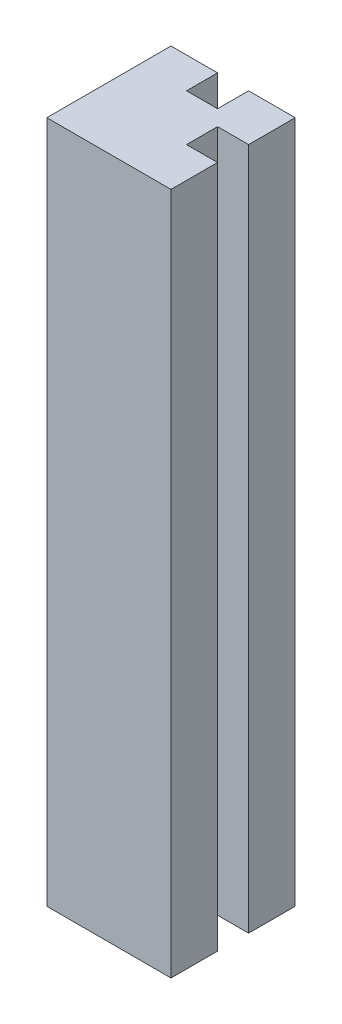
ISO-10303-21;
HEADER;
FILE_DESCRIPTION(('STEP AP214'),'2;1');
FILE_NAME('part.step','',(''),(''),'','','');
FILE_SCHEMA(('AUTOMOTIVE_DESIGN { 1 0 10303 214 1 1 1 1 }'));
ENDSEC;
DATA;
#1=APPLICATION_CONTEXT('core data for automotive mechanical design processes');
#2=APPLICATION_PROTOCOL_DEFINITION('international standard','automotive_design',2000,#1);
#3=PRODUCT_CONTEXT('',#1,'mechanical');
#4=PRODUCT('Part','Part','',(#3));
#5=PRODUCT_RELATED_PRODUCT_CATEGORY('part','',(#4));
#6=PRODUCT_DEFINITION_FORMATION('','',#4);
#7=PRODUCT_DEFINITION_CONTEXT('part definition',#1,'design');
#8=PRODUCT_DEFINITION('design','',#6,#7);
#9=PRODUCT_DEFINITION_SHAPE('','',#8);
#10=(LENGTH_UNIT() NAMED_UNIT(*) SI_UNIT(.MILLI.,.METRE.));
#11=(NAMED_UNIT(*) PLANE_ANGLE_UNIT() SI_UNIT($,.RADIAN.));
#12=(NAMED_UNIT(*) SI_UNIT($,.STERADIAN.) SOLID_ANGLE_UNIT());
#13=UNCERTAINTY_MEASURE_WITH_UNIT(LENGTH_MEASURE(1.E-05),#10,'distance_accuracy_value','');
#14=(GEOMETRIC_REPRESENTATION_CONTEXT(3) GLOBAL_UNCERTAINTY_ASSIGNED_CONTEXT((#13)) GLOBAL_UNIT_ASSIGNED_CONTEXT((#10,
#11,#12)) REPRESENTATION_CONTEXT('',''));
#15=CARTESIAN_POINT('',(0.,0.,0.));
#16=DIRECTION('',(0.,0.,1.));
#17=DIRECTION('',(1.,0.,0.));
#18=AXIS2_PLACEMENT_3D('',#15,#16,#17);
#19=CARTESIAN_POINT('',(10.,110.,-10.));
#20=DIRECTION('',(-1.,0.,0.));
#21=DIRECTION('',(0.,0.,1.));
#22=AXIS2_PLACEMENT_3D('',#19,#20,#21);
#23=PLANE('',#22);
#24=DIRECTION('',(0.,0.,-1.));
#25=VECTOR('',#24,1.);
#26=CARTESIAN_POINT('',(10.,0.,-10.));
#27=LINE('',#26,#25);
#28=CARTESIAN_POINT('',(10.,0.,10.));
#29=VERTEX_POINT('',#28);
#30=CARTESIAN_POINT('',(10.,0.,2.5));
#31=VERTEX_POINT('',#30);
#32=EDGE_CURVE('E189',#29,#31,#27,.T.);
#33=ORIENTED_EDGE('',*,*,#32,.T.);
#34=DIRECTION('',(0.,1.,0.));
#35=VECTOR('',#34,1.);
#36=CARTESIAN_POINT('',(10.,110.,2.5));
#37=LINE('',#36,#35);
#38=CARTESIAN_POINT('',(10.,110.,2.5));
#39=VERTEX_POINT('',#38);
#40=EDGE_CURVE('E136',#31,#39,#37,.T.);
#41=ORIENTED_EDGE('',*,*,#40,.T.);
#42=DIRECTION('',(0.,0.,-1.));
#43=VECTOR('',#42,1.);
#44=CARTESIAN_POINT('',(10.,110.,-10.));
#45=LINE('',#44,#43);
#46=CARTESIAN_POINT('',(10.,110.,10.));
#47=VERTEX_POINT('',#46);
#48=EDGE_CURVE('E176',#47,#39,#45,.T.);
#49=ORIENTED_EDGE('',*,*,#48,.F.);
#50=DIRECTION('',(0.,-1.,0.));
#51=VECTOR('',#50,1.);
#52=CARTESIAN_POINT('',(10.,110.,10.));
#53=LINE('',#52,#51);
#54=EDGE_CURVE('E188',#47,#29,#53,.T.);
#55=ORIENTED_EDGE('',*,*,#54,.T.);
#56=EDGE_LOOP('',(#33,#41,#49,#55));
#57=FACE_BOUND('',#56,.T.);
#58=ADVANCED_FACE('F33',(#57),#23,.F.);
#59=CARTESIAN_POINT('',(-10.,110.,-10.));
#60=DIRECTION('',(0.,0.,1.));
#61=DIRECTION('',(1.,0.,0.));
#62=AXIS2_PLACEMENT_3D('',#59,#60,#61);
#63=PLANE('',#62);
#64=DIRECTION('',(-1.,0.,0.));
#65=VECTOR('',#64,1.);
#66=CARTESIAN_POINT('',(-10.,0.,-10.));
#67=LINE('',#66,#65);
#68=CARTESIAN_POINT('',(10.,0.,-10.));
#69=VERTEX_POINT('',#68);
#70=CARTESIAN_POINT('',(2.5,0.,-10.));
#71=VERTEX_POINT('',#70);
#72=EDGE_CURVE('E192',#69,#71,#67,.T.);
#73=ORIENTED_EDGE('',*,*,#72,.T.);
#74=DIRECTION('',(0.,1.,0.));
#75=VECTOR('',#74,1.);
#76=CARTESIAN_POINT('',(2.5,110.,-10.));
#77=LINE('',#76,#75);
#78=CARTESIAN_POINT('',(2.5,110.,-10.));
#79=VERTEX_POINT('',#78);
#80=EDGE_CURVE('E172',#71,#79,#77,.T.);
#81=ORIENTED_EDGE('',*,*,#80,.T.);
#82=DIRECTION('',(-1.,0.,0.));
#83=VECTOR('',#82,1.);
#84=CARTESIAN_POINT('',(-10.,110.,-10.));
#85=LINE('',#84,#83);
#86=CARTESIAN_POINT('',(10.,110.,-10.));
#87=VERTEX_POINT('',#86);
#88=EDGE_CURVE('E181',#87,#79,#85,.T.);
#89=ORIENTED_EDGE('',*,*,#88,.F.);
#90=DIRECTION('',(0.,-1.,0.));
#91=VECTOR('',#90,1.);
#92=CARTESIAN_POINT('',(10.,110.,-10.));
#93=LINE('',#92,#91);
#94=EDGE_CURVE('E207',#87,#69,#93,.T.);
#95=ORIENTED_EDGE('',*,*,#94,.T.);
#96=EDGE_LOOP('',(#73,#81,#89,#95));
#97=FACE_BOUND('',#96,.T.);
#98=ADVANCED_FACE('F231',(#97),#63,.F.);
#99=CARTESIAN_POINT('',(10.,110.,-2.5));
#100=VERTEX_POINT('',#99);
#101=EDGE_CURVE('E180',#100,#87,#45,.T.);
#102=ORIENTED_EDGE('',*,*,#101,.F.);
#103=DIRECTION('',(0.,-1.,0.));
#104=VECTOR('',#103,1.);
#105=CARTESIAN_POINT('',(10.,110.,-2.5));
#106=LINE('',#105,#104);
#107=CARTESIAN_POINT('',(10.,0.,-2.5));
#108=VERTEX_POINT('',#107);
#109=EDGE_CURVE('E129',#100,#108,#106,.T.);
#110=ORIENTED_EDGE('',*,*,#109,.T.);
#111=EDGE_CURVE('E175',#108,#69,#27,.T.);
#112=ORIENTED_EDGE('',*,*,#111,.T.);
#113=ORIENTED_EDGE('',*,*,#94,.F.);
#114=EDGE_LOOP('',(#102,#110,#112,#113));
#115=FACE_BOUND('',#114,.T.);
#116=ADVANCED_FACE('F35',(#115),#23,.F.);
#117=CARTESIAN_POINT('',(-2.5,110.,-10.));
#118=VERTEX_POINT('',#117);
#119=CARTESIAN_POINT('',(-10.,110.,-10.));
#120=VERTEX_POINT('',#119);
#121=EDGE_CURVE('E179',#118,#120,#85,.T.);
#122=ORIENTED_EDGE('',*,*,#121,.F.);
#123=DIRECTION('',(0.,-1.,0.));
#124=VECTOR('',#123,1.);
#125=CARTESIAN_POINT('',(-2.5,110.,-10.));
#126=LINE('',#125,#124);
#127=CARTESIAN_POINT('',(-2.5,0.,-10.));
#128=VERTEX_POINT('',#127);
#129=EDGE_CURVE('E168',#118,#128,#126,.T.);
#130=ORIENTED_EDGE('',*,*,#129,.T.);
#131=CARTESIAN_POINT('',(-10.,0.,-10.));
#132=VERTEX_POINT('',#131);
#133=EDGE_CURVE('E191',#128,#132,#67,.T.);
#134=ORIENTED_EDGE('',*,*,#133,.T.);
#135=DIRECTION('',(0.,-1.,0.));
#136=VECTOR('',#135,1.);
#137=CARTESIAN_POINT('',(-10.,110.,-10.));
#138=LINE('',#137,#136);
#139=EDGE_CURVE('E204',#120,#132,#138,.T.);
#140=ORIENTED_EDGE('',*,*,#139,.F.);
#141=EDGE_LOOP('',(#122,#130,#134,#140));
#142=FACE_BOUND('',#141,.T.);
#143=ADVANCED_FACE('F217',(#142),#63,.F.);
#144=CARTESIAN_POINT('',(-10.,110.,-10.));
#145=DIRECTION('',(1.,0.,0.));
#146=DIRECTION('',(0.,0.,-1.));
#147=AXIS2_PLACEMENT_3D('',#144,#145,#146);
#148=PLANE('',#147);
#149=DIRECTION('',(0.,0.,1.));
#150=VECTOR('',#149,1.);
#151=CARTESIAN_POINT('',(-10.,0.,-10.));
#152=LINE('',#151,#150);
#153=CARTESIAN_POINT('',(-10.,0.,10.));
#154=VERTEX_POINT('',#153);
#155=EDGE_CURVE('E195',#132,#154,#152,.T.);
#156=ORIENTED_EDGE('',*,*,#155,.T.);
#157=DIRECTION('',(0.,-1.,0.));
#158=VECTOR('',#157,1.);
#159=CARTESIAN_POINT('',(-10.,110.,10.));
#160=LINE('',#159,#158);
#161=CARTESIAN_POINT('',(-10.,110.,10.));
#162=VERTEX_POINT('',#161);
#163=EDGE_CURVE('E201',#162,#154,#160,.T.);
#164=ORIENTED_EDGE('',*,*,#163,.F.);
#165=DIRECTION('',(0.,0.,1.));
#166=VECTOR('',#165,1.);
#167=CARTESIAN_POINT('',(-10.,110.,-10.));
#168=LINE('',#167,#166);
#169=EDGE_CURVE('E184',#120,#162,#168,.T.);
#170=ORIENTED_EDGE('',*,*,#169,.F.);
#171=ORIENTED_EDGE('',*,*,#139,.T.);
#172=EDGE_LOOP('',(#156,#164,#170,#171));
#173=FACE_BOUND('',#172,.T.);
#174=ADVANCED_FACE('F247',(#173),#148,.F.);
#175=CARTESIAN_POINT('',(-10.,110.,10.));
#176=DIRECTION('',(0.,0.,-1.));
#177=DIRECTION('',(-1.,0.,0.));
#178=AXIS2_PLACEMENT_3D('',#175,#176,#177);
#179=PLANE('',#178);
#180=DIRECTION('',(1.,0.,0.));
#181=VECTOR('',#180,1.);
#182=CARTESIAN_POINT('',(-10.,0.,10.));
#183=LINE('',#182,#181);
#184=EDGE_CURVE('E197',#154,#29,#183,.T.);
#185=ORIENTED_EDGE('',*,*,#184,.T.);
#186=ORIENTED_EDGE('',*,*,#54,.F.);
#187=DIRECTION('',(1.,0.,0.));
#188=VECTOR('',#187,1.);
#189=CARTESIAN_POINT('',(-10.,110.,10.));
#190=LINE('',#189,#188);
#191=EDGE_CURVE('E186',#162,#47,#190,.T.);
#192=ORIENTED_EDGE('',*,*,#191,.F.);
#193=ORIENTED_EDGE('',*,*,#163,.T.);
#194=EDGE_LOOP('',(#185,#186,#192,#193));
#195=FACE_BOUND('',#194,.T.);
#196=ADVANCED_FACE('F244',(#195),#179,.F.);
#197=CARTESIAN_POINT('',(0.,110.,0.));
#198=DIRECTION('',(0.,1.,0.));
#199=DIRECTION('',(0.,0.,1.));
#200=AXIS2_PLACEMENT_3D('',#197,#198,#199);
#201=PLANE('',#200);
#202=DIRECTION('',(1.,0.,0.));
#203=VECTOR('',#202,1.);
#204=CARTESIAN_POINT('',(5.00000000000001,110.,2.5));
#205=LINE('',#204,#203);
#206=CARTESIAN_POINT('',(5.00000000000001,110.,2.5));
#207=VERTEX_POINT('',#206);
#208=EDGE_CURVE('E143',#207,#39,#205,.T.);
#209=ORIENTED_EDGE('',*,*,#208,.F.);
#210=DIRECTION('',(0.,0.,1.));
#211=VECTOR('',#210,1.);
#212=CARTESIAN_POINT('',(5.00000000000001,110.,-2.5));
#213=LINE('',#212,#211);
#214=CARTESIAN_POINT('',(5.00000000000001,110.,-2.5));
#215=VERTEX_POINT('',#214);
#216=EDGE_CURVE('E126',#215,#207,#213,.T.);
#217=ORIENTED_EDGE('',*,*,#216,.F.);
#218=DIRECTION('',(-1.,0.,0.));
#219=VECTOR('',#218,1.);
#220=CARTESIAN_POINT('',(5.00000000000001,110.,-2.5));
#221=LINE('',#220,#219);
#222=EDGE_CURVE('E147',#100,#215,#221,.T.);
#223=ORIENTED_EDGE('',*,*,#222,.F.);
#224=ORIENTED_EDGE('',*,*,#101,.T.);
#225=ORIENTED_EDGE('',*,*,#88,.T.);
#226=DIRECTION('',(0.,0.,-1.));
#227=VECTOR('',#226,1.);
#228=CARTESIAN_POINT('',(2.5,110.,-15.));
#229=LINE('',#228,#227);
#230=CARTESIAN_POINT('',(2.5,110.,-5.00000000000001));
#231=VERTEX_POINT('',#230);
#232=EDGE_CURVE('E154',#231,#79,#229,.T.);
#233=ORIENTED_EDGE('',*,*,#232,.F.);
#234=DIRECTION('',(1.,0.,0.));
#235=VECTOR('',#234,1.);
#236=CARTESIAN_POINT('',(-2.5,110.,-5.00000000000001));
#237=LINE('',#236,#235);
#238=CARTESIAN_POINT('',(-2.5,110.,-5.00000000000001));
#239=VERTEX_POINT('',#238);
#240=EDGE_CURVE('E158',#239,#231,#237,.T.);
#241=ORIENTED_EDGE('',*,*,#240,.F.);
#242=DIRECTION('',(0.,0.,1.));
#243=VECTOR('',#242,1.);
#244=CARTESIAN_POINT('',(-2.49999999999999,110.,-15.));
#245=LINE('',#244,#243);
#246=EDGE_CURVE('E162',#118,#239,#245,.T.);
#247=ORIENTED_EDGE('',*,*,#246,.F.);
#248=ORIENTED_EDGE('',*,*,#121,.T.);
#249=ORIENTED_EDGE('',*,*,#169,.T.);
#250=ORIENTED_EDGE('',*,*,#191,.T.);
#251=ORIENTED_EDGE('',*,*,#48,.T.);
#252=EDGE_LOOP('',(#209,#217,#223,#224,#225,#233,#241,#247,#248,#249,#250,#251));
#253=FACE_BOUND('',#252,.T.);
#254=ADVANCED_FACE('F221',(#253),#201,.T.);
#255=CARTESIAN_POINT('',(0.,0.,0.));
#256=DIRECTION('',(0.,1.,0.));
#257=DIRECTION('',(0.,0.,1.));
#258=AXIS2_PLACEMENT_3D('',#255,#256,#257);
#259=PLANE('',#258);
#260=DIRECTION('',(0.,0.,1.));
#261=VECTOR('',#260,1.);
#262=CARTESIAN_POINT('',(5.00000000000001,0.,-2.5));
#263=LINE('',#262,#261);
#264=CARTESIAN_POINT('',(5.00000000000001,0.,-2.5));
#265=VERTEX_POINT('',#264);
#266=CARTESIAN_POINT('',(5.00000000000001,0.,2.5));
#267=VERTEX_POINT('',#266);
#268=EDGE_CURVE('E48',#265,#267,#263,.T.);
#269=ORIENTED_EDGE('',*,*,#268,.T.);
#270=DIRECTION('',(1.,0.,0.));
#271=VECTOR('',#270,1.);
#272=CARTESIAN_POINT('',(5.00000000000001,0.,2.5));
#273=LINE('',#272,#271);
#274=EDGE_CURVE('E133',#267,#31,#273,.T.);
#275=ORIENTED_EDGE('',*,*,#274,.T.);
#276=ORIENTED_EDGE('',*,*,#32,.F.);
#277=ORIENTED_EDGE('',*,*,#184,.F.);
#278=ORIENTED_EDGE('',*,*,#155,.F.);
#279=ORIENTED_EDGE('',*,*,#133,.F.);
#280=DIRECTION('',(0.,0.,1.));
#281=VECTOR('',#280,1.);
#282=CARTESIAN_POINT('',(-2.5,0.,0.));
#283=LINE('',#282,#281);
#284=CARTESIAN_POINT('',(-2.5,0.,-5.00000000000001));
#285=VERTEX_POINT('',#284);
#286=EDGE_CURVE('E41',#128,#285,#283,.T.);
#287=ORIENTED_EDGE('',*,*,#286,.T.);
#288=DIRECTION('',(1.,0.,0.));
#289=VECTOR('',#288,1.);
#290=CARTESIAN_POINT('',(-2.5,0.,-5.00000000000001));
#291=LINE('',#290,#289);
#292=CARTESIAN_POINT('',(2.5,0.,-5.00000000000001));
#293=VERTEX_POINT('',#292);
#294=EDGE_CURVE('E56',#285,#293,#291,.T.);
#295=ORIENTED_EDGE('',*,*,#294,.T.);
#296=DIRECTION('',(0.,0.,-1.));
#297=VECTOR('',#296,1.);
#298=CARTESIAN_POINT('',(2.5,0.,-15.));
#299=LINE('',#298,#297);
#300=EDGE_CURVE('E155',#293,#71,#299,.T.);
#301=ORIENTED_EDGE('',*,*,#300,.T.);
#302=ORIENTED_EDGE('',*,*,#72,.F.);
#303=ORIENTED_EDGE('',*,*,#111,.F.);
#304=DIRECTION('',(-1.,0.,0.));
#305=VECTOR('',#304,1.);
#306=CARTESIAN_POINT('',(0.,0.,-2.5));
#307=LINE('',#306,#305);
#308=EDGE_CURVE('E11',#108,#265,#307,.T.);
#309=ORIENTED_EDGE('',*,*,#308,.T.);
#310=EDGE_LOOP('',(#269,#275,#276,#277,#278,#279,#287,#295,#301,#302,#303,#309));
#311=FACE_BOUND('',#310,.T.);
#312=ADVANCED_FACE('F141',(#311),#259,.F.);
#313=CARTESIAN_POINT('',(2.5,0.,-15.));
#314=DIRECTION('',(1.,0.,0.));
#315=DIRECTION('',(0.,0.,-1.));
#316=AXIS2_PLACEMENT_3D('',#313,#314,#315);
#317=PLANE('',#316);
#318=ORIENTED_EDGE('',*,*,#300,.F.);
#319=DIRECTION('',(0.,1.,0.));
#320=VECTOR('',#319,1.);
#321=CARTESIAN_POINT('',(2.5,0.,-5.00000000000001));
#322=LINE('',#321,#320);
#323=EDGE_CURVE('E166',#293,#231,#322,.T.);
#324=ORIENTED_EDGE('',*,*,#323,.T.);
#325=ORIENTED_EDGE('',*,*,#232,.T.);
#326=ORIENTED_EDGE('',*,*,#80,.F.);
#327=EDGE_LOOP('',(#318,#324,#325,#326));
#328=FACE_BOUND('',#327,.T.);
#329=ADVANCED_FACE('F229',(#328),#317,.F.);
#330=CARTESIAN_POINT('',(-2.49999999999999,0.,-15.));
#331=DIRECTION('',(-1.,0.,0.));
#332=DIRECTION('',(0.,0.,1.));
#333=AXIS2_PLACEMENT_3D('',#330,#331,#332);
#334=PLANE('',#333);
#335=ORIENTED_EDGE('',*,*,#246,.T.);
#336=DIRECTION('',(0.,1.,0.));
#337=VECTOR('',#336,1.);
#338=CARTESIAN_POINT('',(-2.5,0.,-5.00000000000001));
#339=LINE('',#338,#337);
#340=EDGE_CURVE('E160',#285,#239,#339,.T.);
#341=ORIENTED_EDGE('',*,*,#340,.F.);
#342=ORIENTED_EDGE('',*,*,#286,.F.);
#343=ORIENTED_EDGE('',*,*,#129,.F.);
#344=EDGE_LOOP('',(#335,#341,#342,#343));
#345=FACE_BOUND('',#344,.T.);
#346=ADVANCED_FACE('F213',(#345),#334,.F.);
#347=CARTESIAN_POINT('',(-2.5,0.,-5.00000000000001));
#348=DIRECTION('',(0.,0.,1.));
#349=DIRECTION('',(1.,0.,0.));
#350=AXIS2_PLACEMENT_3D('',#347,#348,#349);
#351=PLANE('',#350);
#352=ORIENTED_EDGE('',*,*,#240,.T.);
#353=ORIENTED_EDGE('',*,*,#323,.F.);
#354=ORIENTED_EDGE('',*,*,#294,.F.);
#355=ORIENTED_EDGE('',*,*,#340,.T.);
#356=EDGE_LOOP('',(#352,#353,#354,#355));
#357=FACE_BOUND('',#356,.T.);
#358=ADVANCED_FACE('F225',(#357),#351,.F.);
#359=CARTESIAN_POINT('',(5.00000000000001,0.,2.5));
#360=DIRECTION('',(0.,0.,1.));
#361=DIRECTION('',(1.,0.,0.));
#362=AXIS2_PLACEMENT_3D('',#359,#360,#361);
#363=PLANE('',#362);
#364=ORIENTED_EDGE('',*,*,#274,.F.);
#365=DIRECTION('',(0.,1.,0.));
#366=VECTOR('',#365,1.);
#367=CARTESIAN_POINT('',(5.00000000000001,0.,2.5));
#368=LINE('',#367,#366);
#369=EDGE_CURVE('E122',#267,#207,#368,.T.);
#370=ORIENTED_EDGE('',*,*,#369,.T.);
#371=ORIENTED_EDGE('',*,*,#208,.T.);
#372=ORIENTED_EDGE('',*,*,#40,.F.);
#373=EDGE_LOOP('',(#364,#370,#371,#372));
#374=FACE_BOUND('',#373,.T.);
#375=ADVANCED_FACE('F134',(#374),#363,.F.);
#376=CARTESIAN_POINT('',(5.00000000000001,0.,-2.5));
#377=DIRECTION('',(0.,0.,-1.));
#378=DIRECTION('',(-1.,0.,0.));
#379=AXIS2_PLACEMENT_3D('',#376,#377,#378);
#380=PLANE('',#379);
#381=ORIENTED_EDGE('',*,*,#222,.T.);
#382=DIRECTION('',(0.,1.,0.));
#383=VECTOR('',#382,1.);
#384=CARTESIAN_POINT('',(5.00000000000001,0.,-2.5));
#385=LINE('',#384,#383);
#386=EDGE_CURVE('E130',#265,#215,#385,.T.);
#387=ORIENTED_EDGE('',*,*,#386,.F.);
#388=ORIENTED_EDGE('',*,*,#308,.F.);
#389=ORIENTED_EDGE('',*,*,#109,.F.);
#390=EDGE_LOOP('',(#381,#387,#388,#389));
#391=FACE_BOUND('',#390,.T.);
#392=ADVANCED_FACE('F238',(#391),#380,.F.);
#393=CARTESIAN_POINT('',(5.00000000000001,0.,-2.5));
#394=DIRECTION('',(-1.,0.,0.));
#395=DIRECTION('',(0.,0.,1.));
#396=AXIS2_PLACEMENT_3D('',#393,#394,#395);
#397=PLANE('',#396);
#398=ORIENTED_EDGE('',*,*,#216,.T.);
#399=ORIENTED_EDGE('',*,*,#369,.F.);
#400=ORIENTED_EDGE('',*,*,#268,.F.);
#401=ORIENTED_EDGE('',*,*,#386,.T.);
#402=EDGE_LOOP('',(#398,#399,#400,#401));
#403=FACE_BOUND('',#402,.T.);
#404=ADVANCED_FACE('F124',(#403),#397,.F.);
#405=CLOSED_SHELL('',(#58,#98,#116,#143,#174,#196,#254,#312,#329,#346,#358,#375,#392,#404));
#406=MANIFOLD_SOLID_BREP('B2',#405);
#407=ADVANCED_BREP_SHAPE_REPRESENTATION('',(#18,#406),#14);
#408=SHAPE_DEFINITION_REPRESENTATION(#9,#407);
ENDSEC;
END-ISO-10303-21;
